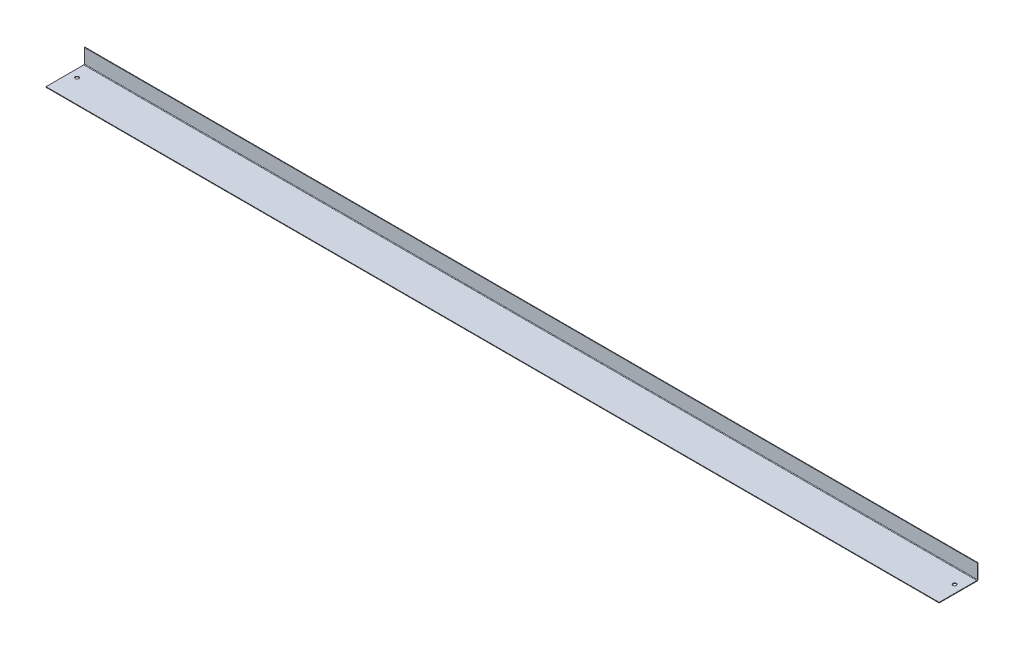
ISO-10303-21;
HEADER;
FILE_DESCRIPTION(('STEP AP214'),'2;1');
FILE_NAME('part.step','',(''),(''),'','','');
FILE_SCHEMA(('AUTOMOTIVE_DESIGN { 1 0 10303 214 1 1 1 1 }'));
ENDSEC;
DATA;
#1=APPLICATION_CONTEXT('core data for automotive mechanical design processes');
#2=APPLICATION_PROTOCOL_DEFINITION('international standard','automotive_design',2000,#1);
#3=PRODUCT_CONTEXT('',#1,'mechanical');
#4=PRODUCT('Part','Part','',(#3));
#5=PRODUCT_RELATED_PRODUCT_CATEGORY('part','',(#4));
#6=PRODUCT_DEFINITION_FORMATION('','',#4);
#7=PRODUCT_DEFINITION_CONTEXT('part definition',#1,'design');
#8=PRODUCT_DEFINITION('design','',#6,#7);
#9=PRODUCT_DEFINITION_SHAPE('','',#8);
#10=(LENGTH_UNIT() NAMED_UNIT(*) SI_UNIT(.MILLI.,.METRE.));
#11=(NAMED_UNIT(*) PLANE_ANGLE_UNIT() SI_UNIT($,.RADIAN.));
#12=(NAMED_UNIT(*) SI_UNIT($,.STERADIAN.) SOLID_ANGLE_UNIT());
#13=UNCERTAINTY_MEASURE_WITH_UNIT(LENGTH_MEASURE(1.E-05),#10,'distance_accuracy_value','');
#14=(GEOMETRIC_REPRESENTATION_CONTEXT(3) GLOBAL_UNCERTAINTY_ASSIGNED_CONTEXT((#13)) GLOBAL_UNIT_ASSIGNED_CONTEXT((#10,
#11,#12)) REPRESENTATION_CONTEXT('',''));
#15=CARTESIAN_POINT('',(0.,0.,0.));
#16=DIRECTION('',(0.,0.,1.));
#17=DIRECTION('',(1.,0.,0.));
#18=AXIS2_PLACEMENT_3D('',#15,#16,#17);
#19=CARTESIAN_POINT('',(1150.,-14.2142857142857,-63.8095238095238));
#20=DIRECTION('',(0.,-1.,0.));
#21=DIRECTION('',(0.,0.,-1.));
#22=AXIS2_PLACEMENT_3D('',#19,#20,#21);
#23=PLANE('',#22);
#24=CARTESIAN_POINT('',(1130.,-14.2142857142857,-23.8095238095238));
#25=DIRECTION('',(0.,-1.,0.));
#26=DIRECTION('',(0.,0.,1.));
#27=AXIS2_PLACEMENT_3D('',#24,#25,#26);
#28=CIRCLE('',#27,4.50000000000001);
#29=CARTESIAN_POINT('',(1130.,-14.2142857142857,-19.3095238095238));
#30=VERTEX_POINT('',#29);
#31=EDGE_CURVE('E174',#30,#30,#28,.T.);
#32=ORIENTED_EDGE('',*,*,#31,.T.);
#33=EDGE_LOOP('',(#32));
#34=FACE_BOUND('',#33,.T.);
#35=CARTESIAN_POINT('',(-1130.,-14.2142857142857,-23.8095238095238));
#36=DIRECTION('',(0.,1.,0.));
#37=DIRECTION('',(0.,0.,1.));
#38=AXIS2_PLACEMENT_3D('',#35,#36,#37);
#39=CIRCLE('',#38,4.50000000000001);
#40=CARTESIAN_POINT('',(-1130.,-14.2142857142857,-19.3095238095238));
#41=VERTEX_POINT('',#40);
#42=EDGE_CURVE('E167',#41,#41,#39,.T.);
#43=ORIENTED_EDGE('',*,*,#42,.F.);
#44=EDGE_LOOP('',(#43));
#45=FACE_BOUND('',#44,.T.);
#46=DIRECTION('',(0.,0.,1.));
#47=VECTOR('',#46,1.);
#48=CARTESIAN_POINT('',(1150.,-14.2142857142857,-63.8095238095238));
#49=LINE('',#48,#47);
#50=CARTESIAN_POINT('',(1150.,-14.2142857142857,-60.8095238095238));
#51=VERTEX_POINT('',#50);
#52=CARTESIAN_POINT('',(1150.,-14.2142857142857,36.1904761904762));
#53=VERTEX_POINT('',#52);
#54=EDGE_CURVE('E99',#51,#53,#49,.T.);
#55=ORIENTED_EDGE('',*,*,#54,.F.);
#56=DIRECTION('',(-1.,0.,0.));
#57=VECTOR('',#56,1.);
#58=CARTESIAN_POINT('',(-1150.,-14.2142857142857,-60.8095238095238));
#59=LINE('',#58,#57);
#60=CARTESIAN_POINT('',(-1150.,-14.2142857142857,-60.8095238095238));
#61=VERTEX_POINT('',#60);
#62=EDGE_CURVE('E119',#51,#61,#59,.T.);
#63=ORIENTED_EDGE('',*,*,#62,.T.);
#64=DIRECTION('',(0.,0.,1.));
#65=VECTOR('',#64,1.);
#66=CARTESIAN_POINT('',(-1150.,-14.2142857142857,-63.8095238095238));
#67=LINE('',#66,#65);
#68=CARTESIAN_POINT('',(-1150.,-14.2142857142857,36.1904761904762));
#69=VERTEX_POINT('',#68);
#70=EDGE_CURVE('E115',#61,#69,#67,.T.);
#71=ORIENTED_EDGE('',*,*,#70,.T.);
#72=DIRECTION('',(-1.,0.,0.));
#73=VECTOR('',#72,1.);
#74=CARTESIAN_POINT('',(1150.,-14.2142857142857,36.1904761904762));
#75=LINE('',#74,#73);
#76=EDGE_CURVE('E113',#53,#69,#75,.T.);
#77=ORIENTED_EDGE('',*,*,#76,.F.);
#78=EDGE_LOOP('',(#55,#63,#71,#77));
#79=FACE_BOUND('',#78,.T.);
#80=ADVANCED_FACE('F34',(#34,#45,#79),#23,.F.);
#81=CARTESIAN_POINT('',(1150.,-15.7142857142857,36.1904761904762));
#82=DIRECTION('',(0.,0.,1.));
#83=DIRECTION('',(1.,0.,0.));
#84=AXIS2_PLACEMENT_3D('',#81,#82,#83);
#85=PLANE('',#84);
#86=DIRECTION('',(0.,1.,0.));
#87=VECTOR('',#86,1.);
#88=CARTESIAN_POINT('',(-1150.,-15.7142857142857,36.1904761904762));
#89=LINE('',#88,#87);
#90=CARTESIAN_POINT('',(-1150.,-15.7142857142857,36.1904761904762));
#91=VERTEX_POINT('',#90);
#92=EDGE_CURVE('E140',#91,#69,#89,.T.);
#93=ORIENTED_EDGE('',*,*,#92,.F.);
#94=DIRECTION('',(-1.,0.,0.));
#95=VECTOR('',#94,1.);
#96=CARTESIAN_POINT('',(1150.,-15.7142857142857,36.1904761904762));
#97=LINE('',#96,#95);
#98=CARTESIAN_POINT('',(1150.,-15.7142857142857,36.1904761904762));
#99=VERTEX_POINT('',#98);
#100=EDGE_CURVE('E120',#99,#91,#97,.T.);
#101=ORIENTED_EDGE('',*,*,#100,.F.);
#102=DIRECTION('',(0.,1.,0.));
#103=VECTOR('',#102,1.);
#104=CARTESIAN_POINT('',(1150.,-15.7142857142857,36.1904761904762));
#105=LINE('',#104,#103);
#106=EDGE_CURVE('E103',#99,#53,#105,.T.);
#107=ORIENTED_EDGE('',*,*,#106,.T.);
#108=ORIENTED_EDGE('',*,*,#76,.T.);
#109=EDGE_LOOP('',(#93,#101,#107,#108));
#110=FACE_BOUND('',#109,.T.);
#111=ADVANCED_FACE('F123',(#110),#85,.T.);
#112=CARTESIAN_POINT('',(1150.,-15.7142857142857,-63.8095238095238));
#113=DIRECTION('',(0.,-1.,0.));
#114=DIRECTION('',(0.,0.,-1.));
#115=AXIS2_PLACEMENT_3D('',#112,#113,#114);
#116=PLANE('',#115);
#117=CARTESIAN_POINT('',(1130.,-15.7142857142857,-23.8095238095238));
#118=DIRECTION('',(0.,-1.,0.));
#119=DIRECTION('',(0.,0.,-1.));
#120=AXIS2_PLACEMENT_3D('',#117,#118,#119);
#121=CIRCLE('',#120,4.50000000000001);
#122=CARTESIAN_POINT('',(1130.,-15.7142857142857,-28.3095238095238));
#123=VERTEX_POINT('',#122);
#124=EDGE_CURVE('E38',#123,#123,#121,.F.);
#125=ORIENTED_EDGE('',*,*,#124,.T.);
#126=EDGE_LOOP('',(#125));
#127=FACE_BOUND('',#126,.T.);
#128=CARTESIAN_POINT('',(-1130.,-15.7142857142857,-23.8095238095238));
#129=DIRECTION('',(0.,-1.,0.));
#130=DIRECTION('',(0.,0.,-1.));
#131=AXIS2_PLACEMENT_3D('',#128,#129,#130);
#132=CIRCLE('',#131,4.50000000000001);
#133=CARTESIAN_POINT('',(-1130.,-15.7142857142857,-28.3095238095238));
#134=VERTEX_POINT('',#133);
#135=EDGE_CURVE('E141',#134,#134,#132,.T.);
#136=ORIENTED_EDGE('',*,*,#135,.F.);
#137=EDGE_LOOP('',(#136));
#138=FACE_BOUND('',#137,.T.);
#139=DIRECTION('',(0.,0.,1.));
#140=VECTOR('',#139,1.);
#141=CARTESIAN_POINT('',(-1150.,-15.7142857142857,-63.8095238095238));
#142=LINE('',#141,#140);
#143=CARTESIAN_POINT('',(-1150.,-15.7142857142857,-60.8095238095238));
#144=VERTEX_POINT('',#143);
#145=EDGE_CURVE('E143',#144,#91,#142,.T.);
#146=ORIENTED_EDGE('',*,*,#145,.F.);
#147=DIRECTION('',(-1.,0.,0.));
#148=VECTOR('',#147,1.);
#149=CARTESIAN_POINT('',(1150.,-15.7142857142857,-60.8095238095238));
#150=LINE('',#149,#148);
#151=CARTESIAN_POINT('',(1150.,-15.7142857142857,-60.8095238095238));
#152=VERTEX_POINT('',#151);
#153=EDGE_CURVE('E43',#144,#152,#150,.F.);
#154=ORIENTED_EDGE('',*,*,#153,.T.);
#155=DIRECTION('',(0.,0.,1.));
#156=VECTOR('',#155,1.);
#157=CARTESIAN_POINT('',(1150.,-15.7142857142857,-63.8095238095238));
#158=LINE('',#157,#156);
#159=EDGE_CURVE('E125',#152,#99,#158,.T.);
#160=ORIENTED_EDGE('',*,*,#159,.T.);
#161=ORIENTED_EDGE('',*,*,#100,.T.);
#162=EDGE_LOOP('',(#146,#154,#160,#161));
#163=FACE_BOUND('',#162,.T.);
#164=ADVANCED_FACE('F196',(#127,#138,#163),#116,.T.);
#165=CARTESIAN_POINT('',(1150.,24.2857142857143,-63.8095238095238));
#166=DIRECTION('',(0.,0.,-1.));
#167=DIRECTION('',(-1.,0.,0.));
#168=AXIS2_PLACEMENT_3D('',#165,#166,#167);
#169=PLANE('',#168);
#170=DIRECTION('',(0.,-1.,0.));
#171=VECTOR('',#170,1.);
#172=CARTESIAN_POINT('',(1150.,24.2857142857143,-63.8095238095238));
#173=LINE('',#172,#171);
#174=CARTESIAN_POINT('',(1150.,24.2857142857143,-63.8095238095238));
#175=VERTEX_POINT('',#174);
#176=CARTESIAN_POINT('',(1150.,-12.7142857142857,-63.8095238095238));
#177=VERTEX_POINT('',#176);
#178=EDGE_CURVE('E127',#175,#177,#173,.T.);
#179=ORIENTED_EDGE('',*,*,#178,.T.);
#180=DIRECTION('',(-1.,0.,0.));
#181=VECTOR('',#180,1.);
#182=CARTESIAN_POINT('',(1150.,-12.7142857142857,-63.8095238095238));
#183=LINE('',#182,#181);
#184=CARTESIAN_POINT('',(-1150.,-12.7142857142857,-63.8095238095238));
#185=VERTEX_POINT('',#184);
#186=EDGE_CURVE('E162',#177,#185,#183,.T.);
#187=ORIENTED_EDGE('',*,*,#186,.T.);
#188=DIRECTION('',(0.,-1.,0.));
#189=VECTOR('',#188,1.);
#190=CARTESIAN_POINT('',(-1150.,24.2857142857143,-63.8095238095238));
#191=LINE('',#190,#189);
#192=CARTESIAN_POINT('',(-1150.,24.2857142857143,-63.8095238095238));
#193=VERTEX_POINT('',#192);
#194=EDGE_CURVE('E145',#193,#185,#191,.T.);
#195=ORIENTED_EDGE('',*,*,#194,.F.);
#196=DIRECTION('',(-1.,0.,0.));
#197=VECTOR('',#196,1.);
#198=CARTESIAN_POINT('',(1150.,24.2857142857143,-63.8095238095238));
#199=LINE('',#198,#197);
#200=EDGE_CURVE('E153',#175,#193,#199,.T.);
#201=ORIENTED_EDGE('',*,*,#200,.F.);
#202=EDGE_LOOP('',(#179,#187,#195,#201));
#203=FACE_BOUND('',#202,.T.);
#204=ADVANCED_FACE('F216',(#203),#169,.T.);
#205=CARTESIAN_POINT('',(1150.,24.2857142857143,-62.3095238095238));
#206=DIRECTION('',(0.,1.,0.));
#207=DIRECTION('',(0.,0.,1.));
#208=AXIS2_PLACEMENT_3D('',#205,#206,#207);
#209=PLANE('',#208);
#210=DIRECTION('',(0.,0.,-1.));
#211=VECTOR('',#210,1.);
#212=CARTESIAN_POINT('',(-1150.,24.2857142857143,-62.3095238095238));
#213=LINE('',#212,#211);
#214=CARTESIAN_POINT('',(-1150.,24.2857142857143,-62.3095238095238));
#215=VERTEX_POINT('',#214);
#216=EDGE_CURVE('E147',#215,#193,#213,.T.);
#217=ORIENTED_EDGE('',*,*,#216,.F.);
#218=DIRECTION('',(-1.,0.,0.));
#219=VECTOR('',#218,1.);
#220=CARTESIAN_POINT('',(1150.,24.2857142857143,-62.3095238095238));
#221=LINE('',#220,#219);
#222=CARTESIAN_POINT('',(1150.,24.2857142857143,-62.3095238095238));
#223=VERTEX_POINT('',#222);
#224=EDGE_CURVE('E138',#223,#215,#221,.T.);
#225=ORIENTED_EDGE('',*,*,#224,.F.);
#226=DIRECTION('',(0.,0.,-1.));
#227=VECTOR('',#226,1.);
#228=CARTESIAN_POINT('',(1150.,24.2857142857143,-62.3095238095238));
#229=LINE('',#228,#227);
#230=EDGE_CURVE('E133',#223,#175,#229,.T.);
#231=ORIENTED_EDGE('',*,*,#230,.T.);
#232=ORIENTED_EDGE('',*,*,#200,.T.);
#233=EDGE_LOOP('',(#217,#225,#231,#232));
#234=FACE_BOUND('',#233,.T.);
#235=ADVANCED_FACE('F219',(#234),#209,.T.);
#236=CARTESIAN_POINT('',(1150.,24.2857142857143,-62.3095238095238));
#237=DIRECTION('',(0.,0.,-1.));
#238=DIRECTION('',(-1.,0.,0.));
#239=AXIS2_PLACEMENT_3D('',#236,#237,#238);
#240=PLANE('',#239);
#241=DIRECTION('',(0.,1.,0.));
#242=VECTOR('',#241,1.);
#243=CARTESIAN_POINT('',(-1150.,24.2857142857143,-62.3095238095238));
#244=LINE('',#243,#242);
#245=CARTESIAN_POINT('',(-1150.,-12.7142857142857,-62.3095238095238));
#246=VERTEX_POINT('',#245);
#247=EDGE_CURVE('E110',#215,#246,#244,.F.);
#248=ORIENTED_EDGE('',*,*,#247,.T.);
#249=DIRECTION('',(-1.,0.,0.));
#250=VECTOR('',#249,1.);
#251=CARTESIAN_POINT('',(1150.,-12.7142857142857,-62.3095238095238));
#252=LINE('',#251,#250);
#253=CARTESIAN_POINT('',(1150.,-12.7142857142857,-62.3095238095238));
#254=VERTEX_POINT('',#253);
#255=EDGE_CURVE('E157',#246,#254,#252,.F.);
#256=ORIENTED_EDGE('',*,*,#255,.T.);
#257=DIRECTION('',(0.,1.,0.));
#258=VECTOR('',#257,1.);
#259=CARTESIAN_POINT('',(1150.,24.2857142857143,-62.3095238095238));
#260=LINE('',#259,#258);
#261=EDGE_CURVE('E136',#223,#254,#260,.F.);
#262=ORIENTED_EDGE('',*,*,#261,.F.);
#263=ORIENTED_EDGE('',*,*,#224,.T.);
#264=EDGE_LOOP('',(#248,#256,#262,#263));
#265=FACE_BOUND('',#264,.T.);
#266=ADVANCED_FACE('F223',(#265),#240,.F.);
#267=CARTESIAN_POINT('',(1150.,0.,0.));
#268=DIRECTION('',(-1.,0.,0.));
#269=DIRECTION('',(0.,0.,1.));
#270=AXIS2_PLACEMENT_3D('',#267,#268,#269);
#271=PLANE('',#270);
#272=ORIENTED_EDGE('',*,*,#159,.F.);
#273=CARTESIAN_POINT('',(1150.,-12.7142857142857,-60.8095238095238));
#274=DIRECTION('',(-1.,0.,0.));
#275=DIRECTION('',(0.,0.,1.));
#276=AXIS2_PLACEMENT_3D('',#273,#274,#275);
#277=CIRCLE('',#276,3.);
#278=EDGE_CURVE('E11',#152,#177,#277,.F.);
#279=ORIENTED_EDGE('',*,*,#278,.T.);
#280=ORIENTED_EDGE('',*,*,#178,.F.);
#281=ORIENTED_EDGE('',*,*,#230,.F.);
#282=ORIENTED_EDGE('',*,*,#261,.T.);
#283=CARTESIAN_POINT('',(1150.,-12.7142857142857,-60.8095238095238));
#284=DIRECTION('',(-1.,0.,0.));
#285=DIRECTION('',(0.,0.,1.));
#286=AXIS2_PLACEMENT_3D('',#283,#284,#285);
#287=CIRCLE('',#286,1.5);
#288=EDGE_CURVE('E106',#254,#51,#287,.T.);
#289=ORIENTED_EDGE('',*,*,#288,.T.);
#290=ORIENTED_EDGE('',*,*,#54,.T.);
#291=ORIENTED_EDGE('',*,*,#106,.F.);
#292=EDGE_LOOP('',(#272,#279,#280,#281,#282,#289,#290,#291));
#293=FACE_BOUND('',#292,.T.);
#294=ADVANCED_FACE('F101',(#293),#271,.F.);
#295=CARTESIAN_POINT('',(-1150.,0.,0.));
#296=DIRECTION('',(-1.,0.,0.));
#297=DIRECTION('',(0.,0.,1.));
#298=AXIS2_PLACEMENT_3D('',#295,#296,#297);
#299=PLANE('',#298);
#300=ORIENTED_EDGE('',*,*,#194,.T.);
#301=CARTESIAN_POINT('',(-1150.,-12.7142857142857,-60.8095238095238));
#302=DIRECTION('',(-1.,0.,0.));
#303=DIRECTION('',(0.,0.,1.));
#304=AXIS2_PLACEMENT_3D('',#301,#302,#303);
#305=CIRCLE('',#304,3.);
#306=EDGE_CURVE('E58',#185,#144,#305,.T.);
#307=ORIENTED_EDGE('',*,*,#306,.T.);
#308=ORIENTED_EDGE('',*,*,#145,.T.);
#309=ORIENTED_EDGE('',*,*,#92,.T.);
#310=ORIENTED_EDGE('',*,*,#70,.F.);
#311=CARTESIAN_POINT('',(-1150.,-12.7142857142857,-60.8095238095238));
#312=DIRECTION('',(-1.,0.,0.));
#313=DIRECTION('',(0.,0.,1.));
#314=AXIS2_PLACEMENT_3D('',#311,#312,#313);
#315=CIRCLE('',#314,1.5);
#316=EDGE_CURVE('E159',#61,#246,#315,.F.);
#317=ORIENTED_EDGE('',*,*,#316,.T.);
#318=ORIENTED_EDGE('',*,*,#247,.F.);
#319=ORIENTED_EDGE('',*,*,#216,.T.);
#320=EDGE_LOOP('',(#300,#307,#308,#309,#310,#317,#318,#319));
#321=FACE_BOUND('',#320,.T.);
#322=ADVANCED_FACE('F201',(#321),#299,.T.);
#323=CARTESIAN_POINT('',(1150.,-12.7142857142857,-60.8095238095238));
#324=DIRECTION('',(1.,0.,0.));
#325=DIRECTION('',(0.,0.,-1.));
#326=AXIS2_PLACEMENT_3D('',#323,#324,#325);
#327=CYLINDRICAL_SURFACE('',#326,1.5);
#328=ORIENTED_EDGE('',*,*,#288,.F.);
#329=ORIENTED_EDGE('',*,*,#255,.F.);
#330=ORIENTED_EDGE('',*,*,#316,.F.);
#331=ORIENTED_EDGE('',*,*,#62,.F.);
#332=EDGE_LOOP('',(#328,#329,#330,#331));
#333=FACE_BOUND('',#332,.T.);
#334=ADVANCED_FACE('F199',(#333),#327,.F.);
#335=CARTESIAN_POINT('',(1150.,-12.7142857142857,-60.8095238095238));
#336=DIRECTION('',(-1.,0.,0.));
#337=DIRECTION('',(0.,0.,1.));
#338=AXIS2_PLACEMENT_3D('',#335,#336,#337);
#339=CYLINDRICAL_SURFACE('',#338,3.);
#340=ORIENTED_EDGE('',*,*,#278,.F.);
#341=ORIENTED_EDGE('',*,*,#153,.F.);
#342=ORIENTED_EDGE('',*,*,#306,.F.);
#343=ORIENTED_EDGE('',*,*,#186,.F.);
#344=EDGE_LOOP('',(#340,#341,#342,#343));
#345=FACE_BOUND('',#344,.T.);
#346=ADVANCED_FACE('F36',(#345),#339,.T.);
#347=CARTESIAN_POINT('',(-1130.,-24.2142857142857,-23.8095238095238));
#348=DIRECTION('',(0.,1.,0.));
#349=DIRECTION('',(0.,0.,1.));
#350=AXIS2_PLACEMENT_3D('',#347,#348,#349);
#351=CYLINDRICAL_SURFACE('',#350,4.50000000000001);
#352=ORIENTED_EDGE('',*,*,#135,.T.);
#353=EDGE_LOOP('',(#352));
#354=FACE_BOUND('',#353,.T.);
#355=ORIENTED_EDGE('',*,*,#42,.T.);
#356=EDGE_LOOP('',(#355));
#357=FACE_BOUND('',#356,.T.);
#358=ADVANCED_FACE('F183',(#354,#357),#351,.F.);
#359=CARTESIAN_POINT('',(1130.,-24.2142857142857,-23.8095238095238));
#360=DIRECTION('',(0.,1.,0.));
#361=DIRECTION('',(0.,0.,1.));
#362=AXIS2_PLACEMENT_3D('',#359,#360,#361);
#363=CYLINDRICAL_SURFACE('',#362,4.50000000000001);
#364=ORIENTED_EDGE('',*,*,#124,.F.);
#365=EDGE_LOOP('',(#364));
#366=FACE_BOUND('',#365,.T.);
#367=ORIENTED_EDGE('',*,*,#31,.F.);
#368=EDGE_LOOP('',(#367));
#369=FACE_BOUND('',#368,.T.);
#370=ADVANCED_FACE('F181',(#366,#369),#363,.F.);
#371=CLOSED_SHELL('',(#80,#111,#164,#204,#235,#266,#294,#322,#334,#346,#358,#370));
#372=MANIFOLD_SOLID_BREP('B2',#371);
#373=ADVANCED_BREP_SHAPE_REPRESENTATION('',(#18,#372),#14);
#374=SHAPE_DEFINITION_REPRESENTATION(#9,#373);
ENDSEC;
END-ISO-10303-21;
